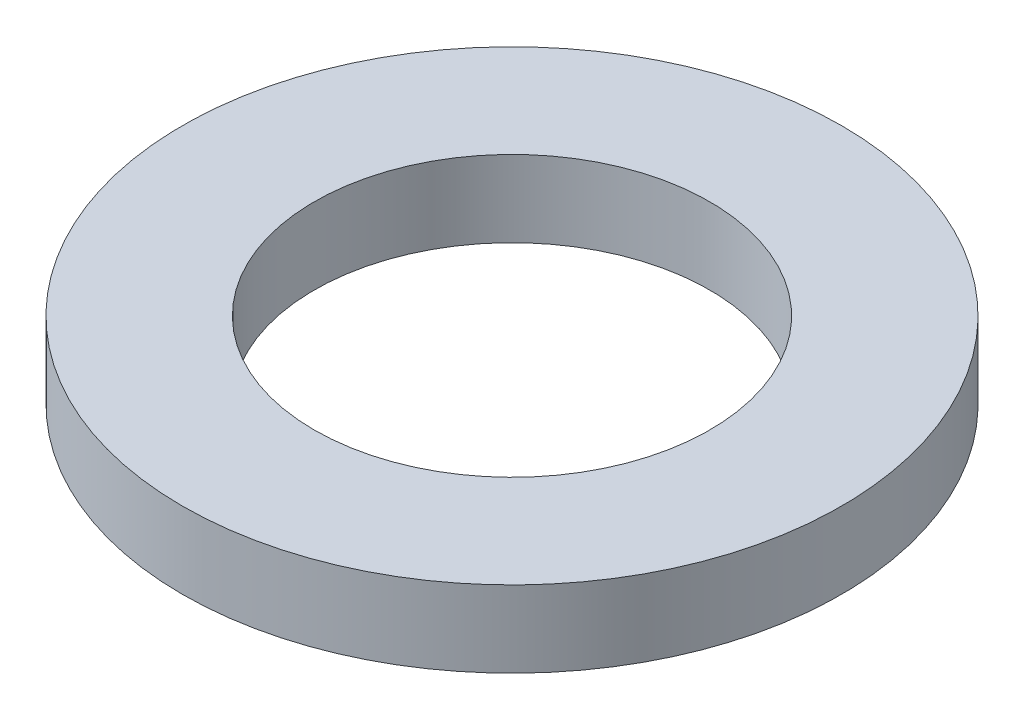
ISO-10303-21;
HEADER;
FILE_DESCRIPTION(('STEP AP214'),'2;1');
FILE_NAME('part.step','',(''),(''),'','','');
FILE_SCHEMA(('AUTOMOTIVE_DESIGN { 1 0 10303 214 1 1 1 1 }'));
ENDSEC;
DATA;
#1=APPLICATION_CONTEXT('core data for automotive mechanical design processes');
#2=APPLICATION_PROTOCOL_DEFINITION('international standard','automotive_design',2000,#1);
#3=PRODUCT_CONTEXT('',#1,'mechanical');
#4=PRODUCT('Part','Part','',(#3));
#5=PRODUCT_RELATED_PRODUCT_CATEGORY('part','',(#4));
#6=PRODUCT_DEFINITION_FORMATION('','',#4);
#7=PRODUCT_DEFINITION_CONTEXT('part definition',#1,'design');
#8=PRODUCT_DEFINITION('design','',#6,#7);
#9=PRODUCT_DEFINITION_SHAPE('','',#8);
#10=(LENGTH_UNIT() NAMED_UNIT(*) SI_UNIT(.MILLI.,.METRE.));
#11=(NAMED_UNIT(*) PLANE_ANGLE_UNIT() SI_UNIT($,.RADIAN.));
#12=(NAMED_UNIT(*) SI_UNIT($,.STERADIAN.) SOLID_ANGLE_UNIT());
#13=UNCERTAINTY_MEASURE_WITH_UNIT(LENGTH_MEASURE(1.E-05),#10,'distance_accuracy_value','');
#14=(GEOMETRIC_REPRESENTATION_CONTEXT(3) GLOBAL_UNCERTAINTY_ASSIGNED_CONTEXT((#13)) GLOBAL_UNIT_ASSIGNED_CONTEXT((#10,
#11,#12)) REPRESENTATION_CONTEXT('',''));
#15=CARTESIAN_POINT('',(0.,0.,0.));
#16=DIRECTION('',(0.,0.,1.));
#17=DIRECTION('',(1.,0.,0.));
#18=AXIS2_PLACEMENT_3D('',#15,#16,#17);
#19=CARTESIAN_POINT('',(0.,5.8,0.));
#20=DIRECTION('',(0.,1.,0.));
#21=DIRECTION('',(0.,0.,1.));
#22=AXIS2_PLACEMENT_3D('',#19,#20,#21);
#23=PLANE('',#22);
#24=CARTESIAN_POINT('',(0.,5.8,0.));
#25=DIRECTION('',(0.,1.,0.));
#26=DIRECTION('',(0.,0.,1.));
#27=AXIS2_PLACEMENT_3D('',#24,#25,#26);
#28=CIRCLE('',#27,25.);
#29=CARTESIAN_POINT('',(0.,5.8,25.));
#30=VERTEX_POINT('',#29);
#31=EDGE_CURVE('E10',#30,#30,#28,.T.);
#32=ORIENTED_EDGE('',*,*,#31,.T.);
#33=EDGE_LOOP('',(#32));
#34=FACE_BOUND('',#33,.T.);
#35=CARTESIAN_POINT('',(0.,5.8,0.));
#36=DIRECTION('',(0.,1.,0.));
#37=DIRECTION('',(0.,0.,1.));
#38=AXIS2_PLACEMENT_3D('',#35,#36,#37);
#39=CIRCLE('',#38,15.);
#40=CARTESIAN_POINT('',(0.,5.8,15.));
#41=VERTEX_POINT('',#40);
#42=EDGE_CURVE('E47',#41,#41,#39,.T.);
#43=ORIENTED_EDGE('',*,*,#42,.F.);
#44=EDGE_LOOP('',(#43));
#45=FACE_BOUND('',#44,.T.);
#46=ADVANCED_FACE('F36',(#34,#45),#23,.T.);
#47=CARTESIAN_POINT('',(0.,0.,0.));
#48=DIRECTION('',(0.,1.,0.));
#49=DIRECTION('',(0.,0.,1.));
#50=AXIS2_PLACEMENT_3D('',#47,#48,#49);
#51=PLANE('',#50);
#52=CARTESIAN_POINT('',(0.,0.,0.));
#53=DIRECTION('',(0.,1.,0.));
#54=DIRECTION('',(0.,0.,1.));
#55=AXIS2_PLACEMENT_3D('',#52,#53,#54);
#56=CIRCLE('',#55,25.);
#57=CARTESIAN_POINT('',(0.,0.,25.));
#58=VERTEX_POINT('',#57);
#59=EDGE_CURVE('E40',#58,#58,#56,.T.);
#60=ORIENTED_EDGE('',*,*,#59,.F.);
#61=EDGE_LOOP('',(#60));
#62=FACE_BOUND('',#61,.T.);
#63=CARTESIAN_POINT('',(0.,0.,0.));
#64=DIRECTION('',(0.,1.,0.));
#65=DIRECTION('',(0.,0.,1.));
#66=AXIS2_PLACEMENT_3D('',#63,#64,#65);
#67=CIRCLE('',#66,15.);
#68=CARTESIAN_POINT('',(0.,0.,15.));
#69=VERTEX_POINT('',#68);
#70=EDGE_CURVE('E49',#69,#69,#67,.T.);
#71=ORIENTED_EDGE('',*,*,#70,.T.);
#72=EDGE_LOOP('',(#71));
#73=FACE_BOUND('',#72,.T.);
#74=ADVANCED_FACE('F59',(#62,#73),#51,.F.);
#75=CARTESIAN_POINT('',(0.,5.8,0.));
#76=DIRECTION('',(0.,-1.,0.));
#77=DIRECTION('',(0.,0.,-1.));
#78=AXIS2_PLACEMENT_3D('',#75,#76,#77);
#79=CYLINDRICAL_SURFACE('',#78,25.);
#80=ORIENTED_EDGE('',*,*,#31,.F.);
#81=EDGE_LOOP('',(#80));
#82=FACE_BOUND('',#81,.T.);
#83=ORIENTED_EDGE('',*,*,#59,.T.);
#84=EDGE_LOOP('',(#83));
#85=FACE_BOUND('',#84,.T.);
#86=ADVANCED_FACE('F38',(#82,#85),#79,.T.);
#87=CARTESIAN_POINT('',(0.,5.8,0.));
#88=DIRECTION('',(0.,-1.,0.));
#89=DIRECTION('',(0.,0.,-1.));
#90=AXIS2_PLACEMENT_3D('',#87,#88,#89);
#91=CYLINDRICAL_SURFACE('',#90,15.);
#92=ORIENTED_EDGE('',*,*,#42,.T.);
#93=EDGE_LOOP('',(#92));
#94=FACE_BOUND('',#93,.T.);
#95=ORIENTED_EDGE('',*,*,#70,.F.);
#96=EDGE_LOOP('',(#95));
#97=FACE_BOUND('',#96,.T.);
#98=ADVANCED_FACE('F55',(#94,#97),#91,.F.);
#99=CLOSED_SHELL('',(#46,#74,#86,#98));
#100=MANIFOLD_SOLID_BREP('B2',#99);
#101=ADVANCED_BREP_SHAPE_REPRESENTATION('',(#18,#100),#14);
#102=SHAPE_DEFINITION_REPRESENTATION(#9,#101);
ENDSEC;
END-ISO-10303-21;
